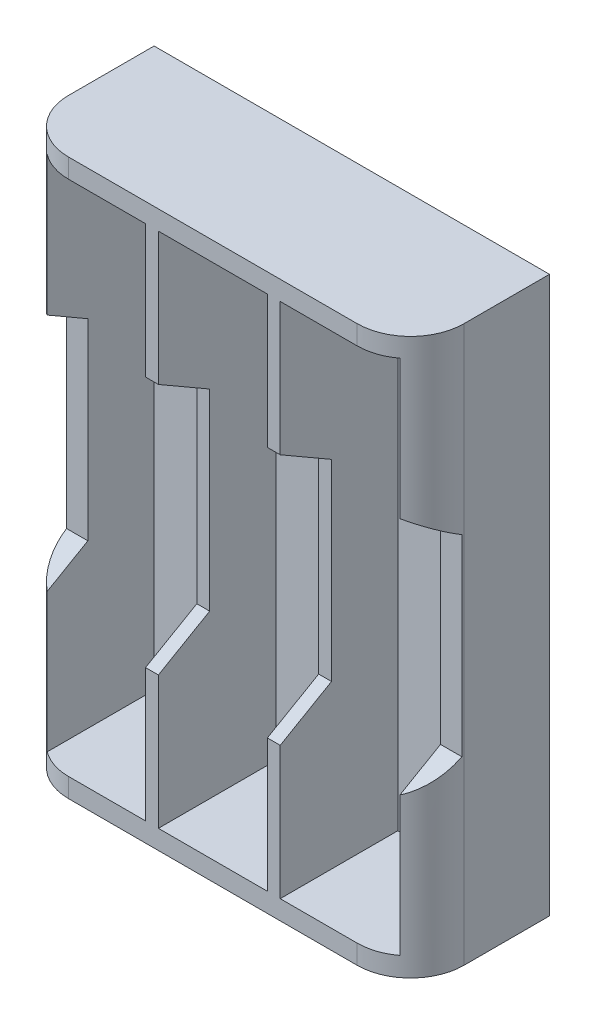
ISO-10303-21;
HEADER;
FILE_DESCRIPTION(('STEP AP214'),'2;1');
FILE_NAME('part.step','',(''),(''),'','','');
FILE_SCHEMA(('AUTOMOTIVE_DESIGN { 1 0 10303 214 1 1 1 1 }'));
ENDSEC;
DATA;
#1=APPLICATION_CONTEXT('core data for automotive mechanical design processes');
#2=APPLICATION_PROTOCOL_DEFINITION('international standard','automotive_design',2000,#1);
#3=PRODUCT_CONTEXT('',#1,'mechanical');
#4=PRODUCT('Part','Part','',(#3));
#5=PRODUCT_RELATED_PRODUCT_CATEGORY('part','',(#4));
#6=PRODUCT_DEFINITION_FORMATION('','',#4);
#7=PRODUCT_DEFINITION_CONTEXT('part definition',#1,'design');
#8=PRODUCT_DEFINITION('design','',#6,#7);
#9=PRODUCT_DEFINITION_SHAPE('','',#8);
#10=(LENGTH_UNIT() NAMED_UNIT(*) SI_UNIT(.MILLI.,.METRE.));
#11=(NAMED_UNIT(*) PLANE_ANGLE_UNIT() SI_UNIT($,.RADIAN.));
#12=(NAMED_UNIT(*) SI_UNIT($,.STERADIAN.) SOLID_ANGLE_UNIT());
#13=UNCERTAINTY_MEASURE_WITH_UNIT(LENGTH_MEASURE(1.E-05),#10,'distance_accuracy_value','');
#14=(GEOMETRIC_REPRESENTATION_CONTEXT(3) GLOBAL_UNCERTAINTY_ASSIGNED_CONTEXT((#13)) GLOBAL_UNIT_ASSIGNED_CONTEXT((#10,
#11,#12)) REPRESENTATION_CONTEXT('',''));
#15=CARTESIAN_POINT('',(0.,0.,0.));
#16=DIRECTION('',(0.,0.,1.));
#17=DIRECTION('',(1.,0.,0.));
#18=AXIS2_PLACEMENT_3D('',#15,#16,#17);
#19=CARTESIAN_POINT('',(-13.5,64.6005181312376,13.));
#20=DIRECTION('',(0.,0.,1.));
#21=DIRECTION('',(1.,0.,0.));
#22=AXIS2_PLACEMENT_3D('',#19,#20,#21);
#23=PLANE('',#22);
#24=DIRECTION('',(1.,0.,0.));
#25=VECTOR('',#24,1.);
#26=CARTESIAN_POINT('',(-13.5,-11.7712812921102,13.));
#27=LINE('',#26,#25);
#28=CARTESIAN_POINT('',(-6.3,-11.7712812921102,13.));
#29=VERTEX_POINT('',#28);
#30=CARTESIAN_POINT('',(-5.1,-11.7712812921102,13.));
#31=VERTEX_POINT('',#30);
#32=EDGE_CURVE('E305',#29,#31,#27,.T.);
#33=ORIENTED_EDGE('',*,*,#32,.F.);
#34=DIRECTION('',(0.,1.,0.));
#35=VECTOR('',#34,1.);
#36=CARTESIAN_POINT('',(-6.3,24.2,13.));
#37=LINE('',#36,#35);
#38=CARTESIAN_POINT('',(-6.3,-24.2,13.));
#39=VERTEX_POINT('',#38);
#40=EDGE_CURVE('E327',#39,#29,#37,.T.);
#41=ORIENTED_EDGE('',*,*,#40,.F.);
#42=DIRECTION('',(1.,0.,0.));
#43=VECTOR('',#42,1.);
#44=CARTESIAN_POINT('',(-13.5,-24.2,13.));
#45=LINE('',#44,#43);
#46=CARTESIAN_POINT('',(-13.5,-24.2,13.));
#47=VERTEX_POINT('',#46);
#48=EDGE_CURVE('E487',#47,#39,#45,.T.);
#49=ORIENTED_EDGE('',*,*,#48,.F.);
#50=DIRECTION('',(0.,-1.,0.));
#51=VECTOR('',#50,1.);
#52=CARTESIAN_POINT('',(-13.5,64.6005181312376,13.));
#53=LINE('',#52,#51);
#54=CARTESIAN_POINT('',(-13.5,-26.,13.));
#55=VERTEX_POINT('',#54);
#56=EDGE_CURVE('E455',#47,#55,#53,.T.);
#57=ORIENTED_EDGE('',*,*,#56,.T.);
#58=DIRECTION('',(-1.,0.,0.));
#59=VECTOR('',#58,1.);
#60=CARTESIAN_POINT('',(-13.5,-26.,13.));
#61=LINE('',#60,#59);
#62=CARTESIAN_POINT('',(13.5,-26.,13.));
#63=VERTEX_POINT('',#62);
#64=EDGE_CURVE('E440',#63,#55,#61,.T.);
#65=ORIENTED_EDGE('',*,*,#64,.F.);
#66=DIRECTION('',(0.,-1.,0.));
#67=VECTOR('',#66,1.);
#68=CARTESIAN_POINT('',(13.5,64.6005181312376,13.));
#69=LINE('',#68,#67);
#70=CARTESIAN_POINT('',(13.5,-24.2,13.));
#71=VERTEX_POINT('',#70);
#72=EDGE_CURVE('E446',#71,#63,#69,.T.);
#73=ORIENTED_EDGE('',*,*,#72,.F.);
#74=DIRECTION('',(1.,0.,0.));
#75=VECTOR('',#74,1.);
#76=CARTESIAN_POINT('',(16.5,-24.2,13.));
#77=LINE('',#76,#75);
#78=CARTESIAN_POINT('',(6.30000000000001,-24.2,13.));
#79=VERTEX_POINT('',#78);
#80=EDGE_CURVE('E361',#79,#71,#77,.T.);
#81=ORIENTED_EDGE('',*,*,#80,.F.);
#82=DIRECTION('',(0.,-1.,0.));
#83=VECTOR('',#82,1.);
#84=CARTESIAN_POINT('',(6.3,24.2,13.));
#85=LINE('',#84,#83);
#86=CARTESIAN_POINT('',(6.30000000000001,-11.7712812921102,13.));
#87=VERTEX_POINT('',#86);
#88=EDGE_CURVE('E360',#87,#79,#85,.T.);
#89=ORIENTED_EDGE('',*,*,#88,.F.);
#90=CARTESIAN_POINT('',(5.1,-11.7712812921102,13.));
#91=VERTEX_POINT('',#90);
#92=EDGE_CURVE('E308',#91,#87,#27,.T.);
#93=ORIENTED_EDGE('',*,*,#92,.F.);
#94=DIRECTION('',(0.,1.,0.));
#95=VECTOR('',#94,1.);
#96=CARTESIAN_POINT('',(5.1,24.2,13.));
#97=LINE('',#96,#95);
#98=CARTESIAN_POINT('',(5.1,-24.2,13.));
#99=VERTEX_POINT('',#98);
#100=EDGE_CURVE('E405',#99,#91,#97,.T.);
#101=ORIENTED_EDGE('',*,*,#100,.F.);
#102=DIRECTION('',(1.,0.,0.));
#103=VECTOR('',#102,1.);
#104=CARTESIAN_POINT('',(-5.1,-24.2,13.));
#105=LINE('',#104,#103);
#106=CARTESIAN_POINT('',(-5.1,-24.2,13.));
#107=VERTEX_POINT('',#106);
#108=EDGE_CURVE('E395',#107,#99,#105,.T.);
#109=ORIENTED_EDGE('',*,*,#108,.F.);
#110=DIRECTION('',(0.,-1.,0.));
#111=VECTOR('',#110,1.);
#112=CARTESIAN_POINT('',(-5.1,24.2,13.));
#113=LINE('',#112,#111);
#114=EDGE_CURVE('E401',#31,#107,#113,.T.);
#115=ORIENTED_EDGE('',*,*,#114,.F.);
#116=EDGE_LOOP('',(#33,#41,#49,#57,#65,#73,#81,#89,#93,#101,#109,#115));
#117=FACE_BOUND('',#116,.T.);
#118=ADVANCED_FACE('F34',(#117),#23,.T.);
#119=CARTESIAN_POINT('',(18.5,-26.,2.));
#120=DIRECTION('',(-1.,0.,0.));
#121=DIRECTION('',(0.,0.,1.));
#122=AXIS2_PLACEMENT_3D('',#119,#120,#121);
#123=PLANE('',#122);
#124=DIRECTION('',(0.,1.,0.));
#125=VECTOR('',#124,1.);
#126=CARTESIAN_POINT('',(18.5,-26.,0.));
#127=LINE('',#126,#125);
#128=CARTESIAN_POINT('',(18.5,-26.,0.));
#129=VERTEX_POINT('',#128);
#130=CARTESIAN_POINT('',(18.5,26.,0.));
#131=VERTEX_POINT('',#130);
#132=EDGE_CURVE('E460',#129,#131,#127,.T.);
#133=ORIENTED_EDGE('',*,*,#132,.T.);
#134=DIRECTION('',(0.,0.,-1.));
#135=VECTOR('',#134,1.);
#136=CARTESIAN_POINT('',(18.5,26.,2.));
#137=LINE('',#136,#135);
#138=CARTESIAN_POINT('',(18.5,26.,8.));
#139=VERTEX_POINT('',#138);
#140=EDGE_CURVE('E478',#139,#131,#137,.T.);
#141=ORIENTED_EDGE('',*,*,#140,.F.);
#142=DIRECTION('',(0.,-1.,0.));
#143=VECTOR('',#142,1.);
#144=CARTESIAN_POINT('',(18.5,64.6005181312376,8.));
#145=LINE('',#144,#143);
#146=CARTESIAN_POINT('',(18.5,-26.,8.));
#147=VERTEX_POINT('',#146);
#148=EDGE_CURVE('E434',#139,#147,#145,.T.);
#149=ORIENTED_EDGE('',*,*,#148,.T.);
#150=DIRECTION('',(0.,0.,-1.));
#151=VECTOR('',#150,1.);
#152=CARTESIAN_POINT('',(18.5,-26.,2.));
#153=LINE('',#152,#151);
#154=EDGE_CURVE('E469',#147,#129,#153,.T.);
#155=ORIENTED_EDGE('',*,*,#154,.T.);
#156=EDGE_LOOP('',(#133,#141,#149,#155));
#157=FACE_BOUND('',#156,.T.);
#158=ADVANCED_FACE('F36',(#157),#123,.F.);
#159=CARTESIAN_POINT('',(-18.5,26.,2.));
#160=DIRECTION('',(0.,-1.,0.));
#161=DIRECTION('',(0.,0.,-1.));
#162=AXIS2_PLACEMENT_3D('',#159,#160,#161);
#163=PLANE('',#162);
#164=DIRECTION('',(-1.,0.,0.));
#165=VECTOR('',#164,1.);
#166=CARTESIAN_POINT('',(-18.5,26.,0.));
#167=LINE('',#166,#165);
#168=CARTESIAN_POINT('',(-18.5,26.,0.));
#169=VERTEX_POINT('',#168);
#170=EDGE_CURVE('E463',#131,#169,#167,.T.);
#171=ORIENTED_EDGE('',*,*,#170,.T.);
#172=DIRECTION('',(0.,0.,-1.));
#173=VECTOR('',#172,1.);
#174=CARTESIAN_POINT('',(-18.5,26.,2.));
#175=LINE('',#174,#173);
#176=CARTESIAN_POINT('',(-18.5,26.,8.));
#177=VERTEX_POINT('',#176);
#178=EDGE_CURVE('E475',#177,#169,#175,.T.);
#179=ORIENTED_EDGE('',*,*,#178,.F.);
#180=CARTESIAN_POINT('',(-13.5,26.,8.));
#181=DIRECTION('',(0.,-1.,0.));
#182=DIRECTION('',(0.,0.,-1.));
#183=AXIS2_PLACEMENT_3D('',#180,#181,#182);
#184=CIRCLE('',#183,5.);
#185=CARTESIAN_POINT('',(-13.5,26.,13.));
#186=VERTEX_POINT('',#185);
#187=EDGE_CURVE('E431',#177,#186,#184,.F.);
#188=ORIENTED_EDGE('',*,*,#187,.T.);
#189=DIRECTION('',(1.,0.,0.));
#190=VECTOR('',#189,1.);
#191=CARTESIAN_POINT('',(-13.5,26.,13.));
#192=LINE('',#191,#190);
#193=CARTESIAN_POINT('',(13.5,26.,13.));
#194=VERTEX_POINT('',#193);
#195=EDGE_CURVE('E437',#186,#194,#192,.T.);
#196=ORIENTED_EDGE('',*,*,#195,.T.);
#197=CARTESIAN_POINT('',(13.5,26.,8.));
#198=DIRECTION('',(0.,-1.,0.));
#199=DIRECTION('',(0.,0.,-1.));
#200=AXIS2_PLACEMENT_3D('',#197,#198,#199);
#201=CIRCLE('',#200,5.);
#202=EDGE_CURVE('E433',#194,#139,#201,.F.);
#203=ORIENTED_EDGE('',*,*,#202,.T.);
#204=ORIENTED_EDGE('',*,*,#140,.T.);
#205=EDGE_LOOP('',(#171,#179,#188,#196,#203,#204));
#206=FACE_BOUND('',#205,.T.);
#207=ADVANCED_FACE('F601',(#206),#163,.F.);
#208=CARTESIAN_POINT('',(-18.5,-26.,2.));
#209=DIRECTION('',(1.,0.,0.));
#210=DIRECTION('',(0.,0.,-1.));
#211=AXIS2_PLACEMENT_3D('',#208,#209,#210);
#212=PLANE('',#211);
#213=DIRECTION('',(0.,-1.,0.));
#214=VECTOR('',#213,1.);
#215=CARTESIAN_POINT('',(-18.5,-26.,0.));
#216=LINE('',#215,#214);
#217=CARTESIAN_POINT('',(-18.5,-26.,0.));
#218=VERTEX_POINT('',#217);
#219=EDGE_CURVE('E465',#169,#218,#216,.T.);
#220=ORIENTED_EDGE('',*,*,#219,.T.);
#221=DIRECTION('',(0.,0.,-1.));
#222=VECTOR('',#221,1.);
#223=CARTESIAN_POINT('',(-18.5,-26.,2.));
#224=LINE('',#223,#222);
#225=CARTESIAN_POINT('',(-18.5,-26.,8.));
#226=VERTEX_POINT('',#225);
#227=EDGE_CURVE('E472',#226,#218,#224,.T.);
#228=ORIENTED_EDGE('',*,*,#227,.F.);
#229=DIRECTION('',(0.,-1.,0.));
#230=VECTOR('',#229,1.);
#231=CARTESIAN_POINT('',(-18.5,64.6005181312376,8.));
#232=LINE('',#231,#230);
#233=EDGE_CURVE('E449',#177,#226,#232,.T.);
#234=ORIENTED_EDGE('',*,*,#233,.F.);
#235=ORIENTED_EDGE('',*,*,#178,.T.);
#236=EDGE_LOOP('',(#220,#228,#234,#235));
#237=FACE_BOUND('',#236,.T.);
#238=ADVANCED_FACE('F853',(#237),#212,.F.);
#239=CARTESIAN_POINT('',(-18.5,-26.,2.));
#240=DIRECTION('',(0.,1.,0.));
#241=DIRECTION('',(0.,0.,1.));
#242=AXIS2_PLACEMENT_3D('',#239,#240,#241);
#243=PLANE('',#242);
#244=DIRECTION('',(1.,0.,0.));
#245=VECTOR('',#244,1.);
#246=CARTESIAN_POINT('',(-18.5,-26.,0.));
#247=LINE('',#246,#245);
#248=EDGE_CURVE('E467',#218,#129,#247,.T.);
#249=ORIENTED_EDGE('',*,*,#248,.T.);
#250=ORIENTED_EDGE('',*,*,#154,.F.);
#251=CARTESIAN_POINT('',(13.5,-26.,8.));
#252=DIRECTION('',(0.,-1.,0.));
#253=DIRECTION('',(0.,0.,-1.));
#254=AXIS2_PLACEMENT_3D('',#251,#252,#253);
#255=CIRCLE('',#254,5.);
#256=EDGE_CURVE('E430',#147,#63,#255,.T.);
#257=ORIENTED_EDGE('',*,*,#256,.T.);
#258=ORIENTED_EDGE('',*,*,#64,.T.);
#259=CARTESIAN_POINT('',(-13.5,-26.,8.));
#260=DIRECTION('',(0.,-1.,0.));
#261=DIRECTION('',(0.,0.,1.));
#262=AXIS2_PLACEMENT_3D('',#259,#260,#261);
#263=CIRCLE('',#262,5.);
#264=EDGE_CURVE('E443',#55,#226,#263,.T.);
#265=ORIENTED_EDGE('',*,*,#264,.T.);
#266=ORIENTED_EDGE('',*,*,#227,.T.);
#267=EDGE_LOOP('',(#249,#250,#257,#258,#265,#266));
#268=FACE_BOUND('',#267,.T.);
#269=ADVANCED_FACE('F594',(#268),#243,.F.);
#270=CARTESIAN_POINT('',(0.,0.,0.));
#271=DIRECTION('',(0.,0.,-1.));
#272=DIRECTION('',(-1.,0.,0.));
#273=AXIS2_PLACEMENT_3D('',#270,#271,#272);
#274=PLANE('',#273);
#275=ORIENTED_EDGE('',*,*,#132,.F.);
#276=ORIENTED_EDGE('',*,*,#248,.F.);
#277=ORIENTED_EDGE('',*,*,#219,.F.);
#278=ORIENTED_EDGE('',*,*,#170,.F.);
#279=EDGE_LOOP('',(#275,#276,#277,#278));
#280=FACE_BOUND('',#279,.T.);
#281=ADVANCED_FACE('F648',(#280),#274,.T.);
#282=CARTESIAN_POINT('',(13.5,64.6005181312376,8.));
#283=DIRECTION('',(0.,-1.,0.));
#284=DIRECTION('',(0.,0.,-1.));
#285=AXIS2_PLACEMENT_3D('',#282,#283,#284);
#286=CYLINDRICAL_SURFACE('',#285,5.);
#287=CARTESIAN_POINT('',(13.5,-8.88452994616207,8.));
#288=DIRECTION('',(0.,-0.86602540378444,-0.499999999999997));
#289=DIRECTION('',(0.,-0.499999999999997,0.86602540378444));
#290=AXIS2_PLACEMENT_3D('',#287,#288,#289);
#291=ELLIPSE('',#290,5.77350269189624,5.);
#292=CARTESIAN_POINT('',(16.5,-11.1939310229206,12.));
#293=VERTEX_POINT('',#292);
#294=CARTESIAN_POINT('',(18.4959983987187,-9.,8.2));
#295=VERTEX_POINT('',#294);
#296=EDGE_CURVE('E318',#293,#295,#291,.F.);
#297=ORIENTED_EDGE('',*,*,#296,.F.);
#298=DIRECTION('',(0.,-1.,0.));
#299=VECTOR('',#298,1.);
#300=CARTESIAN_POINT('',(16.5,64.6005181312376,12.));
#301=LINE('',#300,#299);
#302=CARTESIAN_POINT('',(16.5,-24.2,12.));
#303=VERTEX_POINT('',#302);
#304=EDGE_CURVE('E484',#303,#293,#301,.F.);
#305=ORIENTED_EDGE('',*,*,#304,.F.);
#306=CARTESIAN_POINT('',(13.5,-24.2,8.));
#307=DIRECTION('',(0.,-1.,0.));
#308=DIRECTION('',(1.,0.,0.));
#309=AXIS2_PLACEMENT_3D('',#306,#307,#308);
#310=CIRCLE('',#309,5.);
#311=EDGE_CURVE('E392',#71,#303,#310,.F.);
#312=ORIENTED_EDGE('',*,*,#311,.F.);
#313=ORIENTED_EDGE('',*,*,#72,.T.);
#314=ORIENTED_EDGE('',*,*,#256,.F.);
#315=ORIENTED_EDGE('',*,*,#148,.F.);
#316=ORIENTED_EDGE('',*,*,#202,.F.);
#317=CARTESIAN_POINT('',(13.5,24.2,13.));
#318=VERTEX_POINT('',#317);
#319=EDGE_CURVE('E456',#194,#318,#69,.T.);
#320=ORIENTED_EDGE('',*,*,#319,.T.);
#321=CARTESIAN_POINT('',(13.5,24.2,8.));
#322=DIRECTION('',(0.,1.,0.));
#323=DIRECTION('',(-1.,0.,0.));
#324=AXIS2_PLACEMENT_3D('',#321,#322,#323);
#325=CIRCLE('',#324,5.);
#326=CARTESIAN_POINT('',(16.5,24.2,12.));
#327=VERTEX_POINT('',#326);
#328=EDGE_CURVE('E390',#327,#318,#325,.F.);
#329=ORIENTED_EDGE('',*,*,#328,.F.);
#330=CARTESIAN_POINT('',(16.5,11.1939310229206,12.));
#331=VERTEX_POINT('',#330);
#332=EDGE_CURVE('E483',#331,#327,#301,.F.);
#333=ORIENTED_EDGE('',*,*,#332,.F.);
#334=CARTESIAN_POINT('',(13.5,8.88452994616207,8.));
#335=DIRECTION('',(0.,0.86602540378444,-0.499999999999997));
#336=DIRECTION('',(0.,-0.499999999999997,-0.86602540378444));
#337=AXIS2_PLACEMENT_3D('',#334,#335,#336);
#338=ELLIPSE('',#337,5.77350269189624,5.);
#339=CARTESIAN_POINT('',(18.4959983987187,9.,8.2));
#340=VERTEX_POINT('',#339);
#341=EDGE_CURVE('E297',#340,#331,#338,.F.);
#342=ORIENTED_EDGE('',*,*,#341,.F.);
#343=DIRECTION('',(0.,-1.,0.));
#344=VECTOR('',#343,1.);
#345=CARTESIAN_POINT('',(18.4959983987187,64.6005181312376,8.2));
#346=LINE('',#345,#344);
#347=EDGE_CURVE('E279',#295,#340,#346,.F.);
#348=ORIENTED_EDGE('',*,*,#347,.F.);
#349=EDGE_LOOP('',(#297,#305,#312,#313,#314,#315,#316,#320,#329,#333,#342,#348));
#350=FACE_BOUND('',#349,.T.);
#351=ADVANCED_FACE('F573',(#350),#286,.T.);
#352=CARTESIAN_POINT('',(-13.5,64.6005181312376,8.));
#353=DIRECTION('',(0.,-1.,0.));
#354=DIRECTION('',(0.,0.,-1.));
#355=AXIS2_PLACEMENT_3D('',#352,#353,#354);
#356=CYLINDRICAL_SURFACE('',#355,5.);
#357=CARTESIAN_POINT('',(-13.5,-8.88452994616207,8.));
#358=DIRECTION('',(0.,-0.86602540378444,-0.499999999999997));
#359=DIRECTION('',(0.,-0.499999999999997,0.86602540378444));
#360=AXIS2_PLACEMENT_3D('',#357,#358,#359);
#361=ELLIPSE('',#360,5.77350269189624,5.);
#362=CARTESIAN_POINT('',(-18.4959983987187,-9.,8.2));
#363=VERTEX_POINT('',#362);
#364=CARTESIAN_POINT('',(-16.5,-11.1939310229206,12.));
#365=VERTEX_POINT('',#364);
#366=EDGE_CURVE('E278',#363,#365,#361,.F.);
#367=ORIENTED_EDGE('',*,*,#366,.F.);
#368=DIRECTION('',(0.,-1.,0.));
#369=VECTOR('',#368,1.);
#370=CARTESIAN_POINT('',(-18.4959983987187,64.6005181312376,8.2));
#371=LINE('',#370,#369);
#372=CARTESIAN_POINT('',(-18.4959983987187,9.,8.2));
#373=VERTEX_POINT('',#372);
#374=EDGE_CURVE('E269',#373,#363,#371,.T.);
#375=ORIENTED_EDGE('',*,*,#374,.F.);
#376=CARTESIAN_POINT('',(-13.5,8.88452994616207,8.));
#377=DIRECTION('',(0.,0.86602540378444,-0.499999999999997));
#378=DIRECTION('',(0.,-0.499999999999997,-0.86602540378444));
#379=AXIS2_PLACEMENT_3D('',#376,#377,#378);
#380=ELLIPSE('',#379,5.77350269189624,5.);
#381=CARTESIAN_POINT('',(-16.5,11.1939310229206,12.));
#382=VERTEX_POINT('',#381);
#383=EDGE_CURVE('E255',#382,#373,#380,.F.);
#384=ORIENTED_EDGE('',*,*,#383,.F.);
#385=DIRECTION('',(0.,-1.,0.));
#386=VECTOR('',#385,1.);
#387=CARTESIAN_POINT('',(-16.5,64.6005181312376,12.));
#388=LINE('',#387,#386);
#389=CARTESIAN_POINT('',(-16.5,24.2,12.));
#390=VERTEX_POINT('',#389);
#391=EDGE_CURVE('E490',#390,#382,#388,.T.);
#392=ORIENTED_EDGE('',*,*,#391,.F.);
#393=CARTESIAN_POINT('',(-13.5,24.2,8.));
#394=DIRECTION('',(0.,1.,0.));
#395=DIRECTION('',(0.,0.,1.));
#396=AXIS2_PLACEMENT_3D('',#393,#394,#395);
#397=CIRCLE('',#396,5.);
#398=CARTESIAN_POINT('',(-13.5,24.2,13.));
#399=VERTEX_POINT('',#398);
#400=EDGE_CURVE('E356',#399,#390,#397,.F.);
#401=ORIENTED_EDGE('',*,*,#400,.F.);
#402=EDGE_CURVE('E452',#186,#399,#53,.T.);
#403=ORIENTED_EDGE('',*,*,#402,.F.);
#404=ORIENTED_EDGE('',*,*,#187,.F.);
#405=ORIENTED_EDGE('',*,*,#233,.T.);
#406=ORIENTED_EDGE('',*,*,#264,.F.);
#407=ORIENTED_EDGE('',*,*,#56,.F.);
#408=CARTESIAN_POINT('',(-13.5,-24.2,8.));
#409=DIRECTION('',(0.,-1.,0.));
#410=DIRECTION('',(0.,0.,-1.));
#411=AXIS2_PLACEMENT_3D('',#408,#409,#410);
#412=CIRCLE('',#411,5.);
#413=CARTESIAN_POINT('',(-16.5,-24.2,12.));
#414=VERTEX_POINT('',#413);
#415=EDGE_CURVE('E358',#414,#47,#412,.F.);
#416=ORIENTED_EDGE('',*,*,#415,.F.);
#417=EDGE_CURVE('E489',#365,#414,#388,.T.);
#418=ORIENTED_EDGE('',*,*,#417,.F.);
#419=EDGE_LOOP('',(#367,#375,#384,#392,#401,#403,#404,#405,#406,#407,#416,#418));
#420=FACE_BOUND('',#419,.T.);
#421=ADVANCED_FACE('F276',(#420),#356,.T.);
#422=DIRECTION('',(-1.,0.,0.));
#423=VECTOR('',#422,1.);
#424=CARTESIAN_POINT('',(-13.5,11.7712812921102,13.));
#425=LINE('',#424,#423);
#426=CARTESIAN_POINT('',(6.3,11.7712812921102,13.));
#427=VERTEX_POINT('',#426);
#428=CARTESIAN_POINT('',(5.1,11.7712812921102,13.));
#429=VERTEX_POINT('',#428);
#430=EDGE_CURVE('E291',#427,#429,#425,.T.);
#431=ORIENTED_EDGE('',*,*,#430,.F.);
#432=CARTESIAN_POINT('',(6.3,24.2,13.));
#433=VERTEX_POINT('',#432);
#434=EDGE_CURVE('E364',#433,#427,#85,.T.);
#435=ORIENTED_EDGE('',*,*,#434,.F.);
#436=DIRECTION('',(-1.,0.,0.));
#437=VECTOR('',#436,1.);
#438=CARTESIAN_POINT('',(-13.5,24.2,13.));
#439=LINE('',#438,#437);
#440=EDGE_CURVE('E481',#318,#433,#439,.T.);
#441=ORIENTED_EDGE('',*,*,#440,.F.);
#442=ORIENTED_EDGE('',*,*,#319,.F.);
#443=ORIENTED_EDGE('',*,*,#195,.F.);
#444=ORIENTED_EDGE('',*,*,#402,.T.);
#445=DIRECTION('',(-1.,0.,0.));
#446=VECTOR('',#445,1.);
#447=CARTESIAN_POINT('',(-16.5,24.2,13.));
#448=LINE('',#447,#446);
#449=CARTESIAN_POINT('',(-6.3,24.2,13.));
#450=VERTEX_POINT('',#449);
#451=EDGE_CURVE('E326',#450,#399,#448,.T.);
#452=ORIENTED_EDGE('',*,*,#451,.F.);
#453=CARTESIAN_POINT('',(-6.3,11.7712812921102,13.));
#454=VERTEX_POINT('',#453);
#455=EDGE_CURVE('E331',#454,#450,#37,.T.);
#456=ORIENTED_EDGE('',*,*,#455,.F.);
#457=CARTESIAN_POINT('',(-5.1,11.7712812921102,13.));
#458=VERTEX_POINT('',#457);
#459=EDGE_CURVE('E282',#458,#454,#425,.T.);
#460=ORIENTED_EDGE('',*,*,#459,.F.);
#461=CARTESIAN_POINT('',(-5.1,24.2,13.));
#462=VERTEX_POINT('',#461);
#463=EDGE_CURVE('E398',#462,#458,#113,.T.);
#464=ORIENTED_EDGE('',*,*,#463,.F.);
#465=DIRECTION('',(-1.,0.,0.));
#466=VECTOR('',#465,1.);
#467=CARTESIAN_POINT('',(-5.1,24.2,13.));
#468=LINE('',#467,#466);
#469=CARTESIAN_POINT('',(5.1,24.2,13.));
#470=VERTEX_POINT('',#469);
#471=EDGE_CURVE('E402',#470,#462,#468,.T.);
#472=ORIENTED_EDGE('',*,*,#471,.F.);
#473=EDGE_CURVE('E394',#429,#470,#97,.T.);
#474=ORIENTED_EDGE('',*,*,#473,.F.);
#475=EDGE_LOOP('',(#431,#435,#441,#442,#443,#444,#452,#456,#460,#464,#472,#474));
#476=FACE_BOUND('',#475,.T.);
#477=ADVANCED_FACE('F506',(#476),#23,.T.);
#478=CARTESIAN_POINT('',(0.,0.,2.));
#479=DIRECTION('',(0.,0.,-1.));
#480=DIRECTION('',(-1.,0.,0.));
#481=AXIS2_PLACEMENT_3D('',#478,#479,#480);
#482=PLANE('',#481);
#483=DIRECTION('',(0.,1.,0.));
#484=VECTOR('',#483,1.);
#485=CARTESIAN_POINT('',(5.1,24.2,2.));
#486=LINE('',#485,#484);
#487=CARTESIAN_POINT('',(5.1,-24.2,2.));
#488=VERTEX_POINT('',#487);
#489=CARTESIAN_POINT('',(5.1,24.2,2.));
#490=VERTEX_POINT('',#489);
#491=EDGE_CURVE('E411',#488,#490,#486,.T.);
#492=ORIENTED_EDGE('',*,*,#491,.T.);
#493=DIRECTION('',(-1.,0.,0.));
#494=VECTOR('',#493,1.);
#495=CARTESIAN_POINT('',(-5.1,24.2,2.));
#496=LINE('',#495,#494);
#497=CARTESIAN_POINT('',(-5.1,24.2,2.));
#498=VERTEX_POINT('',#497);
#499=EDGE_CURVE('E397',#490,#498,#496,.T.);
#500=ORIENTED_EDGE('',*,*,#499,.T.);
#501=DIRECTION('',(0.,-1.,0.));
#502=VECTOR('',#501,1.);
#503=CARTESIAN_POINT('',(-5.1,24.2,2.));
#504=LINE('',#503,#502);
#505=CARTESIAN_POINT('',(-5.1,-24.2,2.));
#506=VERTEX_POINT('',#505);
#507=EDGE_CURVE('E420',#498,#506,#504,.T.);
#508=ORIENTED_EDGE('',*,*,#507,.T.);
#509=DIRECTION('',(1.,0.,0.));
#510=VECTOR('',#509,1.);
#511=CARTESIAN_POINT('',(-5.1,-24.2,2.));
#512=LINE('',#511,#510);
#513=EDGE_CURVE('E416',#506,#488,#512,.T.);
#514=ORIENTED_EDGE('',*,*,#513,.T.);
#515=EDGE_LOOP('',(#492,#500,#508,#514));
#516=FACE_BOUND('',#515,.T.);
#517=ADVANCED_FACE('F611',(#516),#482,.F.);
#518=CARTESIAN_POINT('',(-5.1,24.2,-49.4631175725914));
#519=DIRECTION('',(0.,1.,0.));
#520=DIRECTION('',(0.,0.,1.));
#521=AXIS2_PLACEMENT_3D('',#518,#519,#520);
#522=PLANE('',#521);
#523=DIRECTION('',(0.,0.,1.));
#524=VECTOR('',#523,1.);
#525=CARTESIAN_POINT('',(5.1,24.2,-49.4631175725914));
#526=LINE('',#525,#524);
#527=EDGE_CURVE('E414',#490,#470,#526,.T.);
#528=ORIENTED_EDGE('',*,*,#527,.T.);
#529=ORIENTED_EDGE('',*,*,#471,.T.);
#530=DIRECTION('',(0.,0.,1.));
#531=VECTOR('',#530,1.);
#532=CARTESIAN_POINT('',(-5.1,24.2,-49.4631175725914));
#533=LINE('',#532,#531);
#534=EDGE_CURVE('E410',#498,#462,#533,.T.);
#535=ORIENTED_EDGE('',*,*,#534,.F.);
#536=ORIENTED_EDGE('',*,*,#499,.F.);
#537=EDGE_LOOP('',(#528,#529,#535,#536));
#538=FACE_BOUND('',#537,.T.);
#539=ADVANCED_FACE('F616',(#538),#522,.F.);
#540=CARTESIAN_POINT('',(-5.1,24.2,-49.4631175725914));
#541=DIRECTION('',(-1.,0.,0.));
#542=DIRECTION('',(0.,0.,1.));
#543=AXIS2_PLACEMENT_3D('',#540,#541,#542);
#544=PLANE('',#543);
#545=DIRECTION('',(0.,-1.,0.));
#546=VECTOR('',#545,1.);
#547=CARTESIAN_POINT('',(-5.1,24.2,8.2));
#548=LINE('',#547,#546);
#549=CARTESIAN_POINT('',(-5.1,9.,8.2));
#550=VERTEX_POINT('',#549);
#551=CARTESIAN_POINT('',(-5.1,-9.,8.2));
#552=VERTEX_POINT('',#551);
#553=EDGE_CURVE('E280',#550,#552,#548,.T.);
#554=ORIENTED_EDGE('',*,*,#553,.T.);
#555=DIRECTION('',(0.,-0.499999999999997,0.86602540378444));
#556=VECTOR('',#555,1.);
#557=CARTESIAN_POINT('',(-5.1,24.2688623396363,-49.4233598822653));
#558=LINE('',#557,#556);
#559=EDGE_CURVE('E307',#552,#31,#558,.T.);
#560=ORIENTED_EDGE('',*,*,#559,.T.);
#561=ORIENTED_EDGE('',*,*,#114,.T.);
#562=DIRECTION('',(0.,0.,1.));
#563=VECTOR('',#562,1.);
#564=CARTESIAN_POINT('',(-5.1,-24.2,-49.4631175725914));
#565=LINE('',#564,#563);
#566=EDGE_CURVE('E419',#506,#107,#565,.T.);
#567=ORIENTED_EDGE('',*,*,#566,.F.);
#568=ORIENTED_EDGE('',*,*,#507,.F.);
#569=ORIENTED_EDGE('',*,*,#534,.T.);
#570=ORIENTED_EDGE('',*,*,#463,.T.);
#571=DIRECTION('',(0.,-0.499999999999997,-0.86602540378444));
#572=VECTOR('',#571,1.);
#573=CARTESIAN_POINT('',(-5.1,-12.1688623396365,-28.465545110682));
#574=LINE('',#573,#572);
#575=EDGE_CURVE('E290',#458,#550,#574,.T.);
#576=ORIENTED_EDGE('',*,*,#575,.T.);
#577=EDGE_LOOP('',(#554,#560,#561,#567,#568,#569,#570,#576));
#578=FACE_BOUND('',#577,.T.);
#579=ADVANCED_FACE('F614',(#578),#544,.F.);
#580=CARTESIAN_POINT('',(-5.1,-24.2,-49.4631175725914));
#581=DIRECTION('',(0.,-1.,0.));
#582=DIRECTION('',(0.,0.,-1.));
#583=AXIS2_PLACEMENT_3D('',#580,#581,#582);
#584=PLANE('',#583);
#585=ORIENTED_EDGE('',*,*,#566,.T.);
#586=ORIENTED_EDGE('',*,*,#108,.T.);
#587=DIRECTION('',(0.,0.,1.));
#588=VECTOR('',#587,1.);
#589=CARTESIAN_POINT('',(5.1,-24.2,-49.4631175725914));
#590=LINE('',#589,#588);
#591=EDGE_CURVE('E415',#488,#99,#590,.T.);
#592=ORIENTED_EDGE('',*,*,#591,.F.);
#593=ORIENTED_EDGE('',*,*,#513,.F.);
#594=EDGE_LOOP('',(#585,#586,#592,#593));
#595=FACE_BOUND('',#594,.T.);
#596=ADVANCED_FACE('F608',(#595),#584,.F.);
#597=CARTESIAN_POINT('',(5.1,24.2,-49.4631175725914));
#598=DIRECTION('',(1.,0.,0.));
#599=DIRECTION('',(0.,0.,-1.));
#600=AXIS2_PLACEMENT_3D('',#597,#598,#599);
#601=PLANE('',#600);
#602=ORIENTED_EDGE('',*,*,#100,.T.);
#603=DIRECTION('',(0.,0.499999999999997,-0.86602540378444));
#604=VECTOR('',#603,1.);
#605=CARTESIAN_POINT('',(5.1,24.2688623396363,-49.4233598822653));
#606=LINE('',#605,#604);
#607=CARTESIAN_POINT('',(5.1,-9.,8.2));
#608=VERTEX_POINT('',#607);
#609=EDGE_CURVE('E323',#91,#608,#606,.T.);
#610=ORIENTED_EDGE('',*,*,#609,.T.);
#611=DIRECTION('',(0.,1.,0.));
#612=VECTOR('',#611,1.);
#613=CARTESIAN_POINT('',(5.1,24.2,8.2));
#614=LINE('',#613,#612);
#615=CARTESIAN_POINT('',(5.1,9.,8.2));
#616=VERTEX_POINT('',#615);
#617=EDGE_CURVE('E285',#608,#616,#614,.T.);
#618=ORIENTED_EDGE('',*,*,#617,.T.);
#619=DIRECTION('',(0.,0.499999999999997,0.86602540378444));
#620=VECTOR('',#619,1.);
#621=CARTESIAN_POINT('',(5.1,-12.1688623396365,-28.465545110682));
#622=LINE('',#621,#620);
#623=EDGE_CURVE('E302',#616,#429,#622,.T.);
#624=ORIENTED_EDGE('',*,*,#623,.T.);
#625=ORIENTED_EDGE('',*,*,#473,.T.);
#626=ORIENTED_EDGE('',*,*,#527,.F.);
#627=ORIENTED_EDGE('',*,*,#491,.F.);
#628=ORIENTED_EDGE('',*,*,#591,.T.);
#629=EDGE_LOOP('',(#602,#610,#618,#624,#625,#626,#627,#628));
#630=FACE_BOUND('',#629,.T.);
#631=ADVANCED_FACE('F552',(#630),#601,.F.);
#632=CARTESIAN_POINT('',(0.,0.,2.));
#633=DIRECTION('',(0.,0.,-1.));
#634=DIRECTION('',(-1.,0.,0.));
#635=AXIS2_PLACEMENT_3D('',#632,#633,#634);
#636=PLANE('',#635);
#637=DIRECTION('',(-1.,0.,0.));
#638=VECTOR('',#637,1.);
#639=CARTESIAN_POINT('',(16.5,24.2,2.));
#640=LINE('',#639,#638);
#641=CARTESIAN_POINT('',(16.5,24.2,2.));
#642=VERTEX_POINT('',#641);
#643=CARTESIAN_POINT('',(6.3,24.2,2.));
#644=VERTEX_POINT('',#643);
#645=EDGE_CURVE('E370',#642,#644,#640,.T.);
#646=ORIENTED_EDGE('',*,*,#645,.T.);
#647=DIRECTION('',(0.,-1.,0.));
#648=VECTOR('',#647,1.);
#649=CARTESIAN_POINT('',(6.3,24.2,2.));
#650=LINE('',#649,#648);
#651=CARTESIAN_POINT('',(6.30000000000001,-24.2,2.));
#652=VERTEX_POINT('',#651);
#653=EDGE_CURVE('E363',#644,#652,#650,.T.);
#654=ORIENTED_EDGE('',*,*,#653,.T.);
#655=DIRECTION('',(1.,0.,0.));
#656=VECTOR('',#655,1.);
#657=CARTESIAN_POINT('',(16.5,-24.2,2.));
#658=LINE('',#657,#656);
#659=CARTESIAN_POINT('',(16.5,-24.2,2.));
#660=VERTEX_POINT('',#659);
#661=EDGE_CURVE('E379',#652,#660,#658,.T.);
#662=ORIENTED_EDGE('',*,*,#661,.T.);
#663=DIRECTION('',(0.,1.,0.));
#664=VECTOR('',#663,1.);
#665=CARTESIAN_POINT('',(16.5,24.2,2.));
#666=LINE('',#665,#664);
#667=EDGE_CURVE('E375',#660,#642,#666,.T.);
#668=ORIENTED_EDGE('',*,*,#667,.T.);
#669=EDGE_LOOP('',(#646,#654,#662,#668));
#670=FACE_BOUND('',#669,.T.);
#671=ADVANCED_FACE('F583',(#670),#636,.F.);
#672=CARTESIAN_POINT('',(6.3,24.2,-49.4631175725914));
#673=DIRECTION('',(-1.,0.,0.));
#674=DIRECTION('',(0.,-1.,0.));
#675=AXIS2_PLACEMENT_3D('',#672,#673,#674);
#676=PLANE('',#675);
#677=DIRECTION('',(0.,-1.,0.));
#678=VECTOR('',#677,1.);
#679=CARTESIAN_POINT('',(6.3,24.2,8.2));
#680=LINE('',#679,#678);
#681=CARTESIAN_POINT('',(6.3,9.,8.2));
#682=VERTEX_POINT('',#681);
#683=CARTESIAN_POINT('',(6.30000000000001,-9.,8.2));
#684=VERTEX_POINT('',#683);
#685=EDGE_CURVE('E548',#682,#684,#680,.T.);
#686=ORIENTED_EDGE('',*,*,#685,.T.);
#687=DIRECTION('',(0.,-0.499999999999997,0.86602540378444));
#688=VECTOR('',#687,1.);
#689=CARTESIAN_POINT('',(6.3,24.2688623396363,-49.4233598822653));
#690=LINE('',#689,#688);
#691=EDGE_CURVE('E320',#684,#87,#690,.T.);
#692=ORIENTED_EDGE('',*,*,#691,.T.);
#693=ORIENTED_EDGE('',*,*,#88,.T.);
#694=DIRECTION('',(0.,0.,1.));
#695=VECTOR('',#694,1.);
#696=CARTESIAN_POINT('',(6.30000000000001,-24.2,-49.4631175725914));
#697=LINE('',#696,#695);
#698=EDGE_CURVE('E369',#652,#79,#697,.T.);
#699=ORIENTED_EDGE('',*,*,#698,.F.);
#700=ORIENTED_EDGE('',*,*,#653,.F.);
#701=DIRECTION('',(0.,0.,1.));
#702=VECTOR('',#701,1.);
#703=CARTESIAN_POINT('',(6.3,24.2,-49.4631175725914));
#704=LINE('',#703,#702);
#705=EDGE_CURVE('E373',#644,#433,#704,.T.);
#706=ORIENTED_EDGE('',*,*,#705,.T.);
#707=ORIENTED_EDGE('',*,*,#434,.T.);
#708=DIRECTION('',(0.,-0.499999999999997,-0.86602540378444));
#709=VECTOR('',#708,1.);
#710=CARTESIAN_POINT('',(6.30000000000001,-12.1688623396365,-28.465545110682));
#711=LINE('',#710,#709);
#712=EDGE_CURVE('E299',#427,#682,#711,.T.);
#713=ORIENTED_EDGE('',*,*,#712,.T.);
#714=EDGE_LOOP('',(#686,#692,#693,#699,#700,#706,#707,#713));
#715=FACE_BOUND('',#714,.T.);
#716=ADVANCED_FACE('F563',(#715),#676,.F.);
#717=CARTESIAN_POINT('',(16.5,-24.2,-49.4631175725914));
#718=DIRECTION('',(0.,-1.,0.));
#719=DIRECTION('',(1.,0.,0.));
#720=AXIS2_PLACEMENT_3D('',#717,#718,#719);
#721=PLANE('',#720);
#722=ORIENTED_EDGE('',*,*,#311,.T.);
#723=DIRECTION('',(0.,0.,1.));
#724=VECTOR('',#723,1.);
#725=CARTESIAN_POINT('',(16.5,-24.2,-49.4631175725914));
#726=LINE('',#725,#724);
#727=EDGE_CURVE('E378',#660,#303,#726,.T.);
#728=ORIENTED_EDGE('',*,*,#727,.F.);
#729=ORIENTED_EDGE('',*,*,#661,.F.);
#730=ORIENTED_EDGE('',*,*,#698,.T.);
#731=ORIENTED_EDGE('',*,*,#80,.T.);
#732=EDGE_LOOP('',(#722,#728,#729,#730,#731));
#733=FACE_BOUND('',#732,.T.);
#734=ADVANCED_FACE('F587',(#733),#721,.F.);
#735=CARTESIAN_POINT('',(16.5,24.2,-49.4631175725914));
#736=DIRECTION('',(1.,0.,0.));
#737=DIRECTION('',(0.,1.,0.));
#738=AXIS2_PLACEMENT_3D('',#735,#736,#737);
#739=PLANE('',#738);
#740=ORIENTED_EDGE('',*,*,#304,.T.);
#741=DIRECTION('',(0.,0.499999999999997,-0.86602540378444));
#742=VECTOR('',#741,1.);
#743=CARTESIAN_POINT('',(16.5,24.2688623396363,-49.4233598822653));
#744=LINE('',#743,#742);
#745=CARTESIAN_POINT('',(16.5,-9.,8.2));
#746=VERTEX_POINT('',#745);
#747=EDGE_CURVE('E315',#293,#746,#744,.T.);
#748=ORIENTED_EDGE('',*,*,#747,.T.);
#749=DIRECTION('',(0.,1.,0.));
#750=VECTOR('',#749,1.);
#751=CARTESIAN_POINT('',(16.5,24.2,8.2));
#752=LINE('',#751,#750);
#753=CARTESIAN_POINT('',(16.5,9.,8.2));
#754=VERTEX_POINT('',#753);
#755=EDGE_CURVE('E545',#746,#754,#752,.T.);
#756=ORIENTED_EDGE('',*,*,#755,.T.);
#757=DIRECTION('',(0.,0.499999999999997,0.86602540378444));
#758=VECTOR('',#757,1.);
#759=CARTESIAN_POINT('',(16.5,-12.1688623396365,-28.465545110682));
#760=LINE('',#759,#758);
#761=EDGE_CURVE('E265',#754,#331,#760,.T.);
#762=ORIENTED_EDGE('',*,*,#761,.T.);
#763=ORIENTED_EDGE('',*,*,#332,.T.);
#764=DIRECTION('',(0.,0.,1.));
#765=VECTOR('',#764,1.);
#766=CARTESIAN_POINT('',(16.5,24.2,-49.4631175725914));
#767=LINE('',#766,#765);
#768=EDGE_CURVE('E374',#642,#327,#767,.T.);
#769=ORIENTED_EDGE('',*,*,#768,.F.);
#770=ORIENTED_EDGE('',*,*,#667,.F.);
#771=ORIENTED_EDGE('',*,*,#727,.T.);
#772=EDGE_LOOP('',(#740,#748,#756,#762,#763,#769,#770,#771));
#773=FACE_BOUND('',#772,.T.);
#774=ADVANCED_FACE('F577',(#773),#739,.F.);
#775=CARTESIAN_POINT('',(16.5,24.2,-49.4631175725914));
#776=DIRECTION('',(0.,1.,0.));
#777=DIRECTION('',(-1.,0.,0.));
#778=AXIS2_PLACEMENT_3D('',#775,#776,#777);
#779=PLANE('',#778);
#780=ORIENTED_EDGE('',*,*,#328,.T.);
#781=ORIENTED_EDGE('',*,*,#440,.T.);
#782=ORIENTED_EDGE('',*,*,#705,.F.);
#783=ORIENTED_EDGE('',*,*,#645,.F.);
#784=ORIENTED_EDGE('',*,*,#768,.T.);
#785=EDGE_LOOP('',(#780,#781,#782,#783,#784));
#786=FACE_BOUND('',#785,.T.);
#787=ADVANCED_FACE('F579',(#786),#779,.F.);
#788=CARTESIAN_POINT('',(0.,0.,2.));
#789=DIRECTION('',(0.,0.,-1.));
#790=DIRECTION('',(-1.,0.,0.));
#791=AXIS2_PLACEMENT_3D('',#788,#789,#790);
#792=PLANE('',#791);
#793=DIRECTION('',(-1.,0.,0.));
#794=VECTOR('',#793,1.);
#795=CARTESIAN_POINT('',(-16.5,24.2,2.));
#796=LINE('',#795,#794);
#797=CARTESIAN_POINT('',(-6.3,24.2,2.));
#798=VERTEX_POINT('',#797);
#799=CARTESIAN_POINT('',(-16.5,24.2,2.));
#800=VERTEX_POINT('',#799);
#801=EDGE_CURVE('E336',#798,#800,#796,.T.);
#802=ORIENTED_EDGE('',*,*,#801,.T.);
#803=DIRECTION('',(0.,-1.,0.));
#804=VECTOR('',#803,1.);
#805=CARTESIAN_POINT('',(-16.5,24.2,2.));
#806=LINE('',#805,#804);
#807=CARTESIAN_POINT('',(-16.5,-24.2,2.));
#808=VERTEX_POINT('',#807);
#809=EDGE_CURVE('E330',#800,#808,#806,.T.);
#810=ORIENTED_EDGE('',*,*,#809,.T.);
#811=DIRECTION('',(1.,0.,0.));
#812=VECTOR('',#811,1.);
#813=CARTESIAN_POINT('',(-16.5,-24.2,2.));
#814=LINE('',#813,#812);
#815=CARTESIAN_POINT('',(-6.30000000000001,-24.2,2.));
#816=VERTEX_POINT('',#815);
#817=EDGE_CURVE('E345',#808,#816,#814,.T.);
#818=ORIENTED_EDGE('',*,*,#817,.T.);
#819=DIRECTION('',(0.,1.,0.));
#820=VECTOR('',#819,1.);
#821=CARTESIAN_POINT('',(-6.3,24.2,2.));
#822=LINE('',#821,#820);
#823=EDGE_CURVE('E341',#816,#798,#822,.T.);
#824=ORIENTED_EDGE('',*,*,#823,.T.);
#825=EDGE_LOOP('',(#802,#810,#818,#824));
#826=FACE_BOUND('',#825,.T.);
#827=ADVANCED_FACE('F520',(#826),#792,.F.);
#828=CARTESIAN_POINT('',(-16.5,24.2,-49.4631175725914));
#829=DIRECTION('',(-1.,0.,0.));
#830=DIRECTION('',(0.,0.,1.));
#831=AXIS2_PLACEMENT_3D('',#828,#829,#830);
#832=PLANE('',#831);
#833=DIRECTION('',(0.,-1.,0.));
#834=VECTOR('',#833,1.);
#835=CARTESIAN_POINT('',(-16.5,24.2,8.2));
#836=LINE('',#835,#834);
#837=CARTESIAN_POINT('',(-16.5,9.,8.2));
#838=VERTEX_POINT('',#837);
#839=CARTESIAN_POINT('',(-16.5,-9.,8.2));
#840=VERTEX_POINT('',#839);
#841=EDGE_CURVE('E272',#838,#840,#836,.T.);
#842=ORIENTED_EDGE('',*,*,#841,.T.);
#843=DIRECTION('',(0.,-0.499999999999997,0.86602540378444));
#844=VECTOR('',#843,1.);
#845=CARTESIAN_POINT('',(-16.5,24.2688623396363,-49.4233598822653));
#846=LINE('',#845,#844);
#847=EDGE_CURVE('E311',#840,#365,#846,.T.);
#848=ORIENTED_EDGE('',*,*,#847,.T.);
#849=ORIENTED_EDGE('',*,*,#417,.T.);
#850=DIRECTION('',(0.,0.,1.));
#851=VECTOR('',#850,1.);
#852=CARTESIAN_POINT('',(-16.5,-24.2,-49.4631175725914));
#853=LINE('',#852,#851);
#854=EDGE_CURVE('E335',#808,#414,#853,.T.);
#855=ORIENTED_EDGE('',*,*,#854,.F.);
#856=ORIENTED_EDGE('',*,*,#809,.F.);
#857=DIRECTION('',(0.,0.,1.));
#858=VECTOR('',#857,1.);
#859=CARTESIAN_POINT('',(-16.5,24.2,-49.4631175725914));
#860=LINE('',#859,#858);
#861=EDGE_CURVE('E339',#800,#390,#860,.T.);
#862=ORIENTED_EDGE('',*,*,#861,.T.);
#863=ORIENTED_EDGE('',*,*,#391,.T.);
#864=DIRECTION('',(0.,-0.499999999999997,-0.86602540378444));
#865=VECTOR('',#864,1.);
#866=CARTESIAN_POINT('',(-16.5,-12.1688623396365,-28.465545110682));
#867=LINE('',#866,#865);
#868=EDGE_CURVE('E260',#382,#838,#867,.T.);
#869=ORIENTED_EDGE('',*,*,#868,.T.);
#870=EDGE_LOOP('',(#842,#848,#849,#855,#856,#862,#863,#869));
#871=FACE_BOUND('',#870,.T.);
#872=ADVANCED_FACE('F516',(#871),#832,.F.);
#873=CARTESIAN_POINT('',(-16.5,-24.2,-49.4631175725914));
#874=DIRECTION('',(0.,-1.,0.));
#875=DIRECTION('',(0.,0.,-1.));
#876=AXIS2_PLACEMENT_3D('',#873,#874,#875);
#877=PLANE('',#876);
#878=ORIENTED_EDGE('',*,*,#415,.T.);
#879=ORIENTED_EDGE('',*,*,#48,.T.);
#880=DIRECTION('',(0.,0.,1.));
#881=VECTOR('',#880,1.);
#882=CARTESIAN_POINT('',(-6.3,-24.2,-49.4631175725914));
#883=LINE('',#882,#881);
#884=EDGE_CURVE('E344',#816,#39,#883,.T.);
#885=ORIENTED_EDGE('',*,*,#884,.F.);
#886=ORIENTED_EDGE('',*,*,#817,.F.);
#887=ORIENTED_EDGE('',*,*,#854,.T.);
#888=EDGE_LOOP('',(#878,#879,#885,#886,#887));
#889=FACE_BOUND('',#888,.T.);
#890=ADVANCED_FACE('F522',(#889),#877,.F.);
#891=CARTESIAN_POINT('',(-6.3,24.2,-49.4631175725914));
#892=DIRECTION('',(1.,0.,0.));
#893=DIRECTION('',(0.,1.,0.));
#894=AXIS2_PLACEMENT_3D('',#891,#892,#893);
#895=PLANE('',#894);
#896=ORIENTED_EDGE('',*,*,#40,.T.);
#897=DIRECTION('',(0.,0.499999999999997,-0.86602540378444));
#898=VECTOR('',#897,1.);
#899=CARTESIAN_POINT('',(-6.3,24.2688623396363,-49.4233598822653));
#900=LINE('',#899,#898);
#901=CARTESIAN_POINT('',(-6.3,-9.,8.2));
#902=VERTEX_POINT('',#901);
#903=EDGE_CURVE('E12',#29,#902,#900,.T.);
#904=ORIENTED_EDGE('',*,*,#903,.T.);
#905=DIRECTION('',(0.,1.,0.));
#906=VECTOR('',#905,1.);
#907=CARTESIAN_POINT('',(-6.3,24.2,8.2));
#908=LINE('',#907,#906);
#909=CARTESIAN_POINT('',(-6.3,9.,8.2));
#910=VERTEX_POINT('',#909);
#911=EDGE_CURVE('E492',#902,#910,#908,.T.);
#912=ORIENTED_EDGE('',*,*,#911,.T.);
#913=DIRECTION('',(0.,0.499999999999997,0.86602540378444));
#914=VECTOR('',#913,1.);
#915=CARTESIAN_POINT('',(-6.3,-12.1688623396365,-28.465545110682));
#916=LINE('',#915,#914);
#917=EDGE_CURVE('E42',#910,#454,#916,.T.);
#918=ORIENTED_EDGE('',*,*,#917,.T.);
#919=ORIENTED_EDGE('',*,*,#455,.T.);
#920=DIRECTION('',(0.,0.,1.));
#921=VECTOR('',#920,1.);
#922=CARTESIAN_POINT('',(-6.3,24.2,-49.4631175725914));
#923=LINE('',#922,#921);
#924=EDGE_CURVE('E340',#798,#450,#923,.T.);
#925=ORIENTED_EDGE('',*,*,#924,.F.);
#926=ORIENTED_EDGE('',*,*,#823,.F.);
#927=ORIENTED_EDGE('',*,*,#884,.T.);
#928=EDGE_LOOP('',(#896,#904,#912,#918,#919,#925,#926,#927));
#929=FACE_BOUND('',#928,.T.);
#930=ADVANCED_FACE('F498',(#929),#895,.F.);
#931=CARTESIAN_POINT('',(-16.5,24.2,-49.4631175725914));
#932=DIRECTION('',(0.,1.,0.));
#933=DIRECTION('',(0.,0.,1.));
#934=AXIS2_PLACEMENT_3D('',#931,#932,#933);
#935=PLANE('',#934);
#936=ORIENTED_EDGE('',*,*,#400,.T.);
#937=ORIENTED_EDGE('',*,*,#861,.F.);
#938=ORIENTED_EDGE('',*,*,#801,.F.);
#939=ORIENTED_EDGE('',*,*,#924,.T.);
#940=ORIENTED_EDGE('',*,*,#451,.T.);
#941=EDGE_LOOP('',(#936,#937,#938,#939,#940));
#942=FACE_BOUND('',#941,.T.);
#943=ADVANCED_FACE('F512',(#942),#935,.F.);
#944=CARTESIAN_POINT('',(-18.5,9.,8.2));
#945=DIRECTION('',(0.,0.,-1.));
#946=DIRECTION('',(0.,1.,0.));
#947=AXIS2_PLACEMENT_3D('',#944,#945,#946);
#948=PLANE('',#947);
#949=DIRECTION('',(1.,0.,0.));
#950=VECTOR('',#949,1.);
#951=CARTESIAN_POINT('',(-18.5,9.,8.2));
#952=LINE('',#951,#950);
#953=EDGE_CURVE('E273',#910,#550,#952,.T.);
#954=ORIENTED_EDGE('',*,*,#953,.F.);
#955=ORIENTED_EDGE('',*,*,#911,.F.);
#956=DIRECTION('',(1.,0.,0.));
#957=VECTOR('',#956,1.);
#958=CARTESIAN_POINT('',(-18.5,-9.,8.2));
#959=LINE('',#958,#957);
#960=EDGE_CURVE('E537',#902,#552,#959,.T.);
#961=ORIENTED_EDGE('',*,*,#960,.T.);
#962=ORIENTED_EDGE('',*,*,#553,.F.);
#963=EDGE_LOOP('',(#954,#955,#961,#962));
#964=FACE_BOUND('',#963,.T.);
#965=ADVANCED_FACE('F619',(#964),#948,.F.);
#966=CARTESIAN_POINT('',(-18.5,14.6580326380583,18.));
#967=DIRECTION('',(0.,0.86602540378444,-0.499999999999997));
#968=DIRECTION('',(0.,0.499999999999997,0.86602540378444));
#969=AXIS2_PLACEMENT_3D('',#966,#967,#968);
#970=PLANE('',#969);
#971=ORIENTED_EDGE('',*,*,#459,.T.);
#972=ORIENTED_EDGE('',*,*,#917,.F.);
#973=ORIENTED_EDGE('',*,*,#953,.T.);
#974=ORIENTED_EDGE('',*,*,#575,.F.);
#975=EDGE_LOOP('',(#971,#972,#973,#974));
#976=FACE_BOUND('',#975,.T.);
#977=ADVANCED_FACE('F618',(#976),#970,.F.);
#978=CARTESIAN_POINT('',(-18.5,-14.6580326380583,18.));
#979=DIRECTION('',(0.,-0.86602540378444,-0.499999999999997));
#980=DIRECTION('',(0.,0.499999999999997,-0.86602540378444));
#981=AXIS2_PLACEMENT_3D('',#978,#979,#980);
#982=PLANE('',#981);
#983=ORIENTED_EDGE('',*,*,#960,.F.);
#984=ORIENTED_EDGE('',*,*,#903,.F.);
#985=ORIENTED_EDGE('',*,*,#32,.T.);
#986=ORIENTED_EDGE('',*,*,#559,.F.);
#987=EDGE_LOOP('',(#983,#984,#985,#986));
#988=FACE_BOUND('',#987,.T.);
#989=ADVANCED_FACE('F535',(#988),#982,.F.);
#990=ORIENTED_EDGE('',*,*,#374,.T.);
#991=EDGE_CURVE('E539',#363,#840,#959,.T.);
#992=ORIENTED_EDGE('',*,*,#991,.T.);
#993=ORIENTED_EDGE('',*,*,#841,.F.);
#994=EDGE_CURVE('E258',#373,#838,#952,.T.);
#995=ORIENTED_EDGE('',*,*,#994,.F.);
#996=EDGE_LOOP('',(#990,#992,#993,#995));
#997=FACE_BOUND('',#996,.T.);
#998=ADVANCED_FACE('F268',(#997),#948,.F.);
#999=ORIENTED_EDGE('',*,*,#383,.T.);
#1000=ORIENTED_EDGE('',*,*,#994,.T.);
#1001=ORIENTED_EDGE('',*,*,#868,.F.);
#1002=EDGE_LOOP('',(#999,#1000,#1001));
#1003=FACE_BOUND('',#1002,.T.);
#1004=ADVANCED_FACE('F257',(#1003),#970,.F.);
#1005=ORIENTED_EDGE('',*,*,#366,.T.);
#1006=ORIENTED_EDGE('',*,*,#847,.F.);
#1007=ORIENTED_EDGE('',*,*,#991,.F.);
#1008=EDGE_LOOP('',(#1005,#1006,#1007));
#1009=FACE_BOUND('',#1008,.T.);
#1010=ADVANCED_FACE('F675',(#1009),#982,.F.);
#1011=ORIENTED_EDGE('',*,*,#347,.T.);
#1012=EDGE_CURVE('E57',#754,#340,#952,.T.);
#1013=ORIENTED_EDGE('',*,*,#1012,.F.);
#1014=ORIENTED_EDGE('',*,*,#755,.F.);
#1015=EDGE_CURVE('E541',#746,#295,#959,.T.);
#1016=ORIENTED_EDGE('',*,*,#1015,.T.);
#1017=EDGE_LOOP('',(#1011,#1013,#1014,#1016));
#1018=FACE_BOUND('',#1017,.T.);
#1019=ADVANCED_FACE('F630',(#1018),#948,.F.);
#1020=ORIENTED_EDGE('',*,*,#341,.T.);
#1021=ORIENTED_EDGE('',*,*,#761,.F.);
#1022=ORIENTED_EDGE('',*,*,#1012,.T.);
#1023=EDGE_LOOP('',(#1020,#1021,#1022));
#1024=FACE_BOUND('',#1023,.T.);
#1025=ADVANCED_FACE('F568',(#1024),#970,.F.);
#1026=ORIENTED_EDGE('',*,*,#296,.T.);
#1027=ORIENTED_EDGE('',*,*,#1015,.F.);
#1028=ORIENTED_EDGE('',*,*,#747,.F.);
#1029=EDGE_LOOP('',(#1026,#1027,#1028));
#1030=FACE_BOUND('',#1029,.T.);
#1031=ADVANCED_FACE('F683',(#1030),#982,.F.);
#1032=ORIENTED_EDGE('',*,*,#92,.T.);
#1033=ORIENTED_EDGE('',*,*,#691,.F.);
#1034=EDGE_CURVE('E49',#608,#684,#959,.T.);
#1035=ORIENTED_EDGE('',*,*,#1034,.F.);
#1036=ORIENTED_EDGE('',*,*,#609,.F.);
#1037=EDGE_LOOP('',(#1032,#1033,#1035,#1036));
#1038=FACE_BOUND('',#1037,.T.);
#1039=ADVANCED_FACE('F559',(#1038),#982,.F.);
#1040=EDGE_CURVE('E557',#616,#682,#952,.T.);
#1041=ORIENTED_EDGE('',*,*,#1040,.T.);
#1042=ORIENTED_EDGE('',*,*,#712,.F.);
#1043=ORIENTED_EDGE('',*,*,#430,.T.);
#1044=ORIENTED_EDGE('',*,*,#623,.F.);
#1045=EDGE_LOOP('',(#1041,#1042,#1043,#1044));
#1046=FACE_BOUND('',#1045,.T.);
#1047=ADVANCED_FACE('F565',(#1046),#970,.F.);
#1048=ORIENTED_EDGE('',*,*,#1034,.T.);
#1049=ORIENTED_EDGE('',*,*,#685,.F.);
#1050=ORIENTED_EDGE('',*,*,#1040,.F.);
#1051=ORIENTED_EDGE('',*,*,#617,.F.);
#1052=EDGE_LOOP('',(#1048,#1049,#1050,#1051));
#1053=FACE_BOUND('',#1052,.T.);
#1054=ADVANCED_FACE('F555',(#1053),#948,.F.);
#1055=CLOSED_SHELL('',(#118,#158,#207,#238,#269,#281,#351,#421,#477,#517,#539,#579,#596,#631,
#671,#716,#734,#774,#787,#827,#872,#890,#930,#943,#965,#977,#989,#998,#1004,#1010,#1019,#1025,
#1031,#1039,#1047,#1054));
#1056=MANIFOLD_SOLID_BREP('B2',#1055);
#1057=ADVANCED_BREP_SHAPE_REPRESENTATION('',(#18,#1056),#14);
#1058=SHAPE_DEFINITION_REPRESENTATION(#9,#1057);
ENDSEC;
END-ISO-10303-21;
